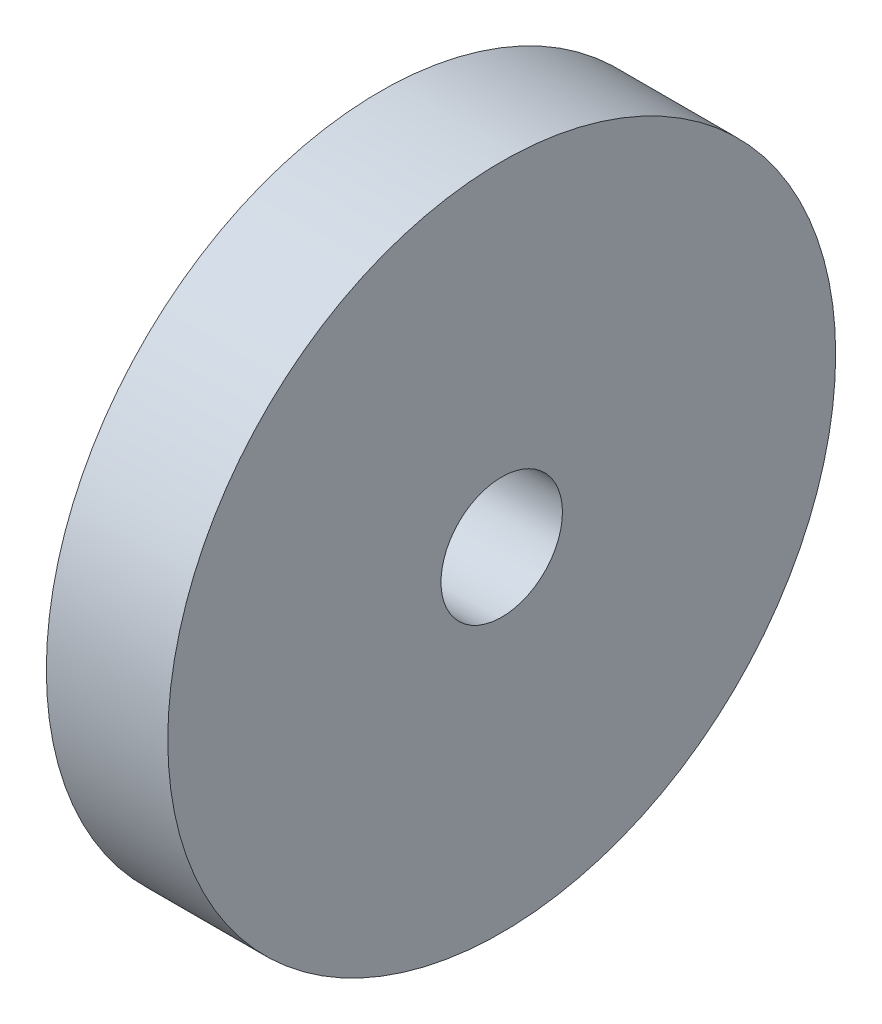
ISO-10303-21;
HEADER;
FILE_DESCRIPTION(('STEP AP214'),'2;1');
FILE_NAME('part.step','',(''),(''),'','','');
FILE_SCHEMA(('AUTOMOTIVE_DESIGN { 1 0 10303 214 1 1 1 1 }'));
ENDSEC;
DATA;
#1=APPLICATION_CONTEXT('core data for automotive mechanical design processes');
#2=APPLICATION_PROTOCOL_DEFINITION('international standard','automotive_design',2000,#1);
#3=PRODUCT_CONTEXT('',#1,'mechanical');
#4=PRODUCT('Part','Part','',(#3));
#5=PRODUCT_RELATED_PRODUCT_CATEGORY('part','',(#4));
#6=PRODUCT_DEFINITION_FORMATION('','',#4);
#7=PRODUCT_DEFINITION_CONTEXT('part definition',#1,'design');
#8=PRODUCT_DEFINITION('design','',#6,#7);
#9=PRODUCT_DEFINITION_SHAPE('','',#8);
#10=(LENGTH_UNIT() NAMED_UNIT(*) SI_UNIT(.MILLI.,.METRE.));
#11=(NAMED_UNIT(*) PLANE_ANGLE_UNIT() SI_UNIT($,.RADIAN.));
#12=(NAMED_UNIT(*) SI_UNIT($,.STERADIAN.) SOLID_ANGLE_UNIT());
#13=UNCERTAINTY_MEASURE_WITH_UNIT(LENGTH_MEASURE(1.E-05),#10,'distance_accuracy_value','');
#14=(GEOMETRIC_REPRESENTATION_CONTEXT(3) GLOBAL_UNCERTAINTY_ASSIGNED_CONTEXT((#13)) GLOBAL_UNIT_ASSIGNED_CONTEXT((#10,
#11,#12)) REPRESENTATION_CONTEXT('',''));
#15=CARTESIAN_POINT('',(0.,0.,0.));
#16=DIRECTION('',(0.,0.,1.));
#17=DIRECTION('',(1.,0.,0.));
#18=AXIS2_PLACEMENT_3D('',#15,#16,#17);
#19=CARTESIAN_POINT('',(2.,0.,0.));
#20=DIRECTION('',(1.,0.,0.));
#21=DIRECTION('',(0.,0.,-1.));
#22=AXIS2_PLACEMENT_3D('',#19,#20,#21);
#23=PLANE('',#22);
#24=CARTESIAN_POINT('',(2.,0.,0.));
#25=DIRECTION('',(1.,0.,0.));
#26=DIRECTION('',(0.,0.,-1.));
#27=AXIS2_PLACEMENT_3D('',#24,#25,#26);
#28=CIRCLE('',#27,5.5);
#29=CARTESIAN_POINT('',(2.,0.,-5.5));
#30=VERTEX_POINT('',#29);
#31=EDGE_CURVE('E10',#30,#30,#28,.T.);
#32=ORIENTED_EDGE('',*,*,#31,.T.);
#33=EDGE_LOOP('',(#32));
#34=FACE_BOUND('',#33,.T.);
#35=CARTESIAN_POINT('',(2.,0.,0.));
#36=DIRECTION('',(1.,0.,0.));
#37=DIRECTION('',(0.,0.,-1.));
#38=AXIS2_PLACEMENT_3D('',#35,#36,#37);
#39=CIRCLE('',#38,1.);
#40=CARTESIAN_POINT('',(2.,0.,-1.));
#41=VERTEX_POINT('',#40);
#42=EDGE_CURVE('E43',#41,#41,#39,.T.);
#43=ORIENTED_EDGE('',*,*,#42,.F.);
#44=EDGE_LOOP('',(#43));
#45=FACE_BOUND('',#44,.T.);
#46=ADVANCED_FACE('F32',(#34,#45),#23,.T.);
#47=CARTESIAN_POINT('',(0.,0.,0.));
#48=DIRECTION('',(1.,0.,0.));
#49=DIRECTION('',(0.,0.,-1.));
#50=AXIS2_PLACEMENT_3D('',#47,#48,#49);
#51=PLANE('',#50);
#52=CARTESIAN_POINT('',(0.,0.,0.));
#53=DIRECTION('',(1.,0.,0.));
#54=DIRECTION('',(0.,0.,-1.));
#55=AXIS2_PLACEMENT_3D('',#52,#53,#54);
#56=CIRCLE('',#55,5.5);
#57=CARTESIAN_POINT('',(0.,0.,-5.5));
#58=VERTEX_POINT('',#57);
#59=EDGE_CURVE('E36',#58,#58,#56,.T.);
#60=ORIENTED_EDGE('',*,*,#59,.F.);
#61=EDGE_LOOP('',(#60));
#62=FACE_BOUND('',#61,.T.);
#63=CARTESIAN_POINT('',(0.,0.,0.));
#64=DIRECTION('',(1.,0.,0.));
#65=DIRECTION('',(0.,0.,-1.));
#66=AXIS2_PLACEMENT_3D('',#63,#64,#65);
#67=CIRCLE('',#66,1.);
#68=CARTESIAN_POINT('',(0.,0.,-1.));
#69=VERTEX_POINT('',#68);
#70=EDGE_CURVE('E45',#69,#69,#67,.T.);
#71=ORIENTED_EDGE('',*,*,#70,.T.);
#72=EDGE_LOOP('',(#71));
#73=FACE_BOUND('',#72,.T.);
#74=ADVANCED_FACE('F55',(#62,#73),#51,.F.);
#75=CARTESIAN_POINT('',(2.,0.,0.));
#76=DIRECTION('',(-1.,0.,0.));
#77=DIRECTION('',(0.,0.,1.));
#78=AXIS2_PLACEMENT_3D('',#75,#76,#77);
#79=CYLINDRICAL_SURFACE('',#78,5.5);
#80=ORIENTED_EDGE('',*,*,#31,.F.);
#81=EDGE_LOOP('',(#80));
#82=FACE_BOUND('',#81,.T.);
#83=ORIENTED_EDGE('',*,*,#59,.T.);
#84=EDGE_LOOP('',(#83));
#85=FACE_BOUND('',#84,.T.);
#86=ADVANCED_FACE('F34',(#82,#85),#79,.T.);
#87=CARTESIAN_POINT('',(2.,0.,0.));
#88=DIRECTION('',(-1.,0.,0.));
#89=DIRECTION('',(0.,0.,1.));
#90=AXIS2_PLACEMENT_3D('',#87,#88,#89);
#91=CYLINDRICAL_SURFACE('',#90,1.);
#92=ORIENTED_EDGE('',*,*,#42,.T.);
#93=EDGE_LOOP('',(#92));
#94=FACE_BOUND('',#93,.T.);
#95=ORIENTED_EDGE('',*,*,#70,.F.);
#96=EDGE_LOOP('',(#95));
#97=FACE_BOUND('',#96,.T.);
#98=ADVANCED_FACE('F51',(#94,#97),#91,.F.);
#99=CLOSED_SHELL('',(#46,#74,#86,#98));
#100=MANIFOLD_SOLID_BREP('B2',#99);
#101=ADVANCED_BREP_SHAPE_REPRESENTATION('',(#18,#100),#14);
#102=SHAPE_DEFINITION_REPRESENTATION(#9,#101);
ENDSEC;
END-ISO-10303-21;
